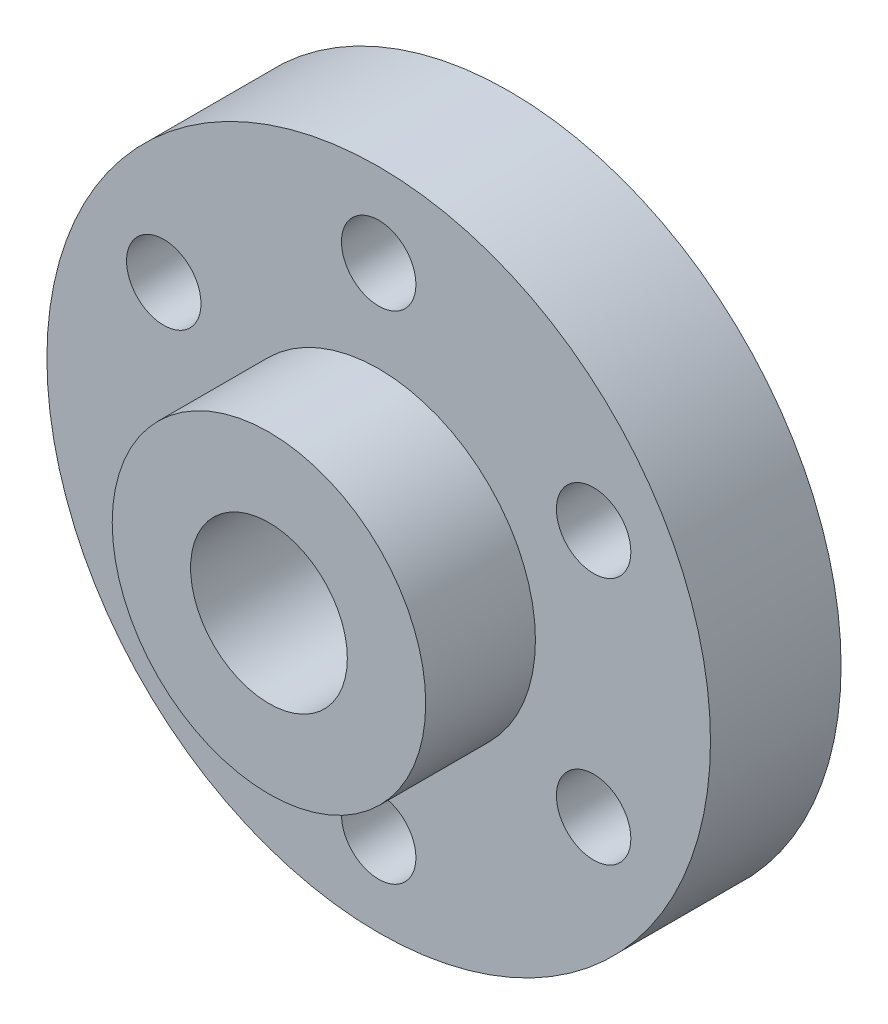
ISO-10303-21;
HEADER;
FILE_DESCRIPTION(('STEP AP214'),'2;1');
FILE_NAME('part.step','',(''),(''),'','','');
FILE_SCHEMA(('AUTOMOTIVE_DESIGN { 1 0 10303 214 1 1 1 1 }'));
ENDSEC;
DATA;
#1=APPLICATION_CONTEXT('core data for automotive mechanical design processes');
#2=APPLICATION_PROTOCOL_DEFINITION('international standard','automotive_design',2000,#1);
#3=PRODUCT_CONTEXT('',#1,'mechanical');
#4=PRODUCT('Part','Part','',(#3));
#5=PRODUCT_RELATED_PRODUCT_CATEGORY('part','',(#4));
#6=PRODUCT_DEFINITION_FORMATION('','',#4);
#7=PRODUCT_DEFINITION_CONTEXT('part definition',#1,'design');
#8=PRODUCT_DEFINITION('design','',#6,#7);
#9=PRODUCT_DEFINITION_SHAPE('','',#8);
#10=(LENGTH_UNIT() NAMED_UNIT(*) SI_UNIT(.MILLI.,.METRE.));
#11=(NAMED_UNIT(*) PLANE_ANGLE_UNIT() SI_UNIT($,.RADIAN.));
#12=(NAMED_UNIT(*) SI_UNIT($,.STERADIAN.) SOLID_ANGLE_UNIT());
#13=UNCERTAINTY_MEASURE_WITH_UNIT(LENGTH_MEASURE(1.E-05),#10,'distance_accuracy_value','');
#14=(GEOMETRIC_REPRESENTATION_CONTEXT(3) GLOBAL_UNCERTAINTY_ASSIGNED_CONTEXT((#13)) GLOBAL_UNIT_ASSIGNED_CONTEXT((#10,
#11,#12)) REPRESENTATION_CONTEXT('',''));
#15=CARTESIAN_POINT('',(0.,0.,0.));
#16=DIRECTION('',(0.,0.,1.));
#17=DIRECTION('',(1.,0.,0.));
#18=AXIS2_PLACEMENT_3D('',#15,#16,#17);
#19=CARTESIAN_POINT('',(0.,0.,5.));
#20=DIRECTION('',(0.,0.,-1.));
#21=DIRECTION('',(-1.,0.,0.));
#22=AXIS2_PLACEMENT_3D('',#19,#20,#21);
#23=CYLINDRICAL_SURFACE('',#22,12.7);
#24=CARTESIAN_POINT('',(0.,0.,5.));
#25=DIRECTION('',(0.,0.,1.));
#26=DIRECTION('',(1.,0.,0.));
#27=AXIS2_PLACEMENT_3D('',#24,#25,#26);
#28=CIRCLE('',#27,12.7);
#29=CARTESIAN_POINT('',(12.7,0.,5.));
#30=VERTEX_POINT('',#29);
#31=EDGE_CURVE('E42',#30,#30,#28,.T.);
#32=ORIENTED_EDGE('',*,*,#31,.F.);
#33=EDGE_LOOP('',(#32));
#34=FACE_BOUND('',#33,.T.);
#35=CARTESIAN_POINT('',(0.,0.,0.));
#36=DIRECTION('',(0.,0.,1.));
#37=DIRECTION('',(1.,0.,0.));
#38=AXIS2_PLACEMENT_3D('',#35,#36,#37);
#39=CIRCLE('',#38,12.7);
#40=CARTESIAN_POINT('',(12.7,0.,0.));
#41=VERTEX_POINT('',#40);
#42=EDGE_CURVE('E47',#41,#41,#39,.T.);
#43=ORIENTED_EDGE('',*,*,#42,.T.);
#44=EDGE_LOOP('',(#43));
#45=FACE_BOUND('',#44,.T.);
#46=ADVANCED_FACE('F35',(#34,#45),#23,.T.);
#47=CARTESIAN_POINT('',(0.,0.,5.));
#48=DIRECTION('',(0.,0.,1.));
#49=DIRECTION('',(1.,0.,0.));
#50=AXIS2_PLACEMENT_3D('',#47,#48,#49);
#51=PLANE('',#50);
#52=CARTESIAN_POINT('',(0.,9.5,5.));
#53=DIRECTION('',(0.,0.,1.));
#54=DIRECTION('',(1.,0.,0.));
#55=AXIS2_PLACEMENT_3D('',#52,#53,#54);
#56=CIRCLE('',#55,1.425);
#57=CARTESIAN_POINT('',(1.425,9.5,5.));
#58=VERTEX_POINT('',#57);
#59=EDGE_CURVE('E60',#58,#58,#56,.T.);
#60=ORIENTED_EDGE('',*,*,#59,.F.);
#61=EDGE_LOOP('',(#60));
#62=FACE_BOUND('',#61,.T.);
#63=CARTESIAN_POINT('',(8.22724133595207,4.75000000000013,5.));
#64=DIRECTION('',(0.,0.,1.));
#65=DIRECTION('',(1.,0.,0.));
#66=AXIS2_PLACEMENT_3D('',#63,#64,#65);
#67=CIRCLE('',#66,1.42500000000018);
#68=CARTESIAN_POINT('',(9.65224133595225,4.75000000000013,5.));
#69=VERTEX_POINT('',#68);
#70=EDGE_CURVE('E69',#69,#69,#67,.T.);
#71=ORIENTED_EDGE('',*,*,#70,.F.);
#72=EDGE_LOOP('',(#71));
#73=FACE_BOUND('',#72,.T.);
#74=CARTESIAN_POINT('',(8.22724133595214,-4.74999999999972,5.));
#75=DIRECTION('',(0.,0.,1.));
#76=DIRECTION('',(1.,0.,0.));
#77=AXIS2_PLACEMENT_3D('',#74,#75,#76);
#78=CIRCLE('',#77,1.42500000000031);
#79=CARTESIAN_POINT('',(9.65224133595244,-4.74999999999972,5.));
#80=VERTEX_POINT('',#79);
#81=EDGE_CURVE('E75',#80,#80,#78,.T.);
#82=ORIENTED_EDGE('',*,*,#81,.F.);
#83=EDGE_LOOP('',(#82));
#84=FACE_BOUND('',#83,.T.);
#85=CARTESIAN_POINT('',(1.2878355113985E-13,-9.49999999999971,5.));
#86=DIRECTION('',(0.,0.,1.));
#87=DIRECTION('',(1.,0.,0.));
#88=AXIS2_PLACEMENT_3D('',#85,#86,#87);
#89=CIRCLE('',#88,1.42500000000027);
#90=CARTESIAN_POINT('',(1.4250000000004,-9.49999999999971,5.));
#91=VERTEX_POINT('',#90);
#92=EDGE_CURVE('E88',#91,#91,#89,.T.);
#93=ORIENTED_EDGE('',*,*,#92,.F.);
#94=EDGE_LOOP('',(#93));
#95=FACE_BOUND('',#94,.T.);
#96=CARTESIAN_POINT('',(-8.22724133595194,-4.74999999999984,5.));
#97=DIRECTION('',(0.,0.,1.));
#98=DIRECTION('',(1.,0.,0.));
#99=AXIS2_PLACEMENT_3D('',#96,#97,#98);
#100=CIRCLE('',#99,1.42500000000014);
#101=CARTESIAN_POINT('',(-6.80224133595181,-4.74999999999984,5.));
#102=VERTEX_POINT('',#101);
#103=EDGE_CURVE('E82',#102,#102,#100,.T.);
#104=ORIENTED_EDGE('',*,*,#103,.F.);
#105=EDGE_LOOP('',(#104));
#106=FACE_BOUND('',#105,.T.);
#107=CARTESIAN_POINT('',(-8.22724133595201,4.75000000000001,5.));
#108=DIRECTION('',(0.,0.,1.));
#109=DIRECTION('',(1.,0.,0.));
#110=AXIS2_PLACEMENT_3D('',#107,#108,#109);
#111=CIRCLE('',#110,1.42500000000006);
#112=CARTESIAN_POINT('',(-6.80224133595195,4.75000000000001,5.));
#113=VERTEX_POINT('',#112);
#114=EDGE_CURVE('E76',#113,#113,#111,.T.);
#115=ORIENTED_EDGE('',*,*,#114,.F.);
#116=EDGE_LOOP('',(#115));
#117=FACE_BOUND('',#116,.T.);
#118=CARTESIAN_POINT('',(0.,0.,5.));
#119=DIRECTION('',(0.,0.,1.));
#120=DIRECTION('',(1.,0.,0.));
#121=AXIS2_PLACEMENT_3D('',#118,#119,#120);
#122=CIRCLE('',#121,6.);
#123=CARTESIAN_POINT('',(6.,0.,5.));
#124=VERTEX_POINT('',#123);
#125=EDGE_CURVE('E10',#124,#124,#122,.T.);
#126=ORIENTED_EDGE('',*,*,#125,.F.);
#127=EDGE_LOOP('',(#126));
#128=FACE_BOUND('',#127,.T.);
#129=ORIENTED_EDGE('',*,*,#31,.T.);
#130=EDGE_LOOP('',(#129));
#131=FACE_BOUND('',#130,.T.);
#132=ADVANCED_FACE('F104',(#62,#73,#84,#95,#106,#117,#128,#131),#51,.T.);
#133=CARTESIAN_POINT('',(0.,0.,0.));
#134=DIRECTION('',(0.,0.,1.));
#135=DIRECTION('',(1.,0.,0.));
#136=AXIS2_PLACEMENT_3D('',#133,#134,#135);
#137=PLANE('',#136);
#138=CARTESIAN_POINT('',(0.,0.,0.));
#139=DIRECTION('',(0.,0.,1.));
#140=DIRECTION('',(1.,0.,0.));
#141=AXIS2_PLACEMENT_3D('',#138,#139,#140);
#142=CIRCLE('',#141,3.);
#143=CARTESIAN_POINT('',(3.,0.,0.));
#144=VERTEX_POINT('',#143);
#145=EDGE_CURVE('E242',#144,#144,#142,.T.);
#146=ORIENTED_EDGE('',*,*,#145,.T.);
#147=EDGE_LOOP('',(#146));
#148=FACE_BOUND('',#147,.T.);
#149=CARTESIAN_POINT('',(0.,9.5,0.));
#150=DIRECTION('',(0.,0.,1.));
#151=DIRECTION('',(1.,0.,0.));
#152=AXIS2_PLACEMENT_3D('',#149,#150,#151);
#153=CIRCLE('',#152,1.425);
#154=CARTESIAN_POINT('',(1.425,9.5,0.));
#155=VERTEX_POINT('',#154);
#156=EDGE_CURVE('E56',#155,#155,#153,.F.);
#157=ORIENTED_EDGE('',*,*,#156,.F.);
#158=EDGE_LOOP('',(#157));
#159=FACE_BOUND('',#158,.T.);
#160=CARTESIAN_POINT('',(8.22724133595207,4.75000000000013,0.));
#161=DIRECTION('',(0.,0.,1.));
#162=DIRECTION('',(1.,0.,0.));
#163=AXIS2_PLACEMENT_3D('',#160,#161,#162);
#164=CIRCLE('',#163,1.42500000000018);
#165=CARTESIAN_POINT('',(9.65224133595225,4.75000000000013,0.));
#166=VERTEX_POINT('',#165);
#167=EDGE_CURVE('E72',#166,#166,#164,.F.);
#168=ORIENTED_EDGE('',*,*,#167,.F.);
#169=EDGE_LOOP('',(#168));
#170=FACE_BOUND('',#169,.T.);
#171=CARTESIAN_POINT('',(8.22724133595214,-4.74999999999972,0.));
#172=DIRECTION('',(0.,0.,1.));
#173=DIRECTION('',(1.,0.,0.));
#174=AXIS2_PLACEMENT_3D('',#171,#172,#173);
#175=CIRCLE('',#174,1.42500000000031);
#176=CARTESIAN_POINT('',(9.65224133595244,-4.74999999999972,0.));
#177=VERTEX_POINT('',#176);
#178=EDGE_CURVE('E91',#177,#177,#175,.F.);
#179=ORIENTED_EDGE('',*,*,#178,.F.);
#180=EDGE_LOOP('',(#179));
#181=FACE_BOUND('',#180,.T.);
#182=CARTESIAN_POINT('',(1.2878355113985E-13,-9.49999999999971,0.));
#183=DIRECTION('',(0.,0.,1.));
#184=DIRECTION('',(1.,0.,0.));
#185=AXIS2_PLACEMENT_3D('',#182,#183,#184);
#186=CIRCLE('',#185,1.42500000000027);
#187=CARTESIAN_POINT('',(1.4250000000004,-9.49999999999971,0.));
#188=VERTEX_POINT('',#187);
#189=EDGE_CURVE('E85',#188,#188,#186,.F.);
#190=ORIENTED_EDGE('',*,*,#189,.F.);
#191=EDGE_LOOP('',(#190));
#192=FACE_BOUND('',#191,.T.);
#193=CARTESIAN_POINT('',(-8.22724133595194,-4.74999999999984,0.));
#194=DIRECTION('',(0.,0.,1.));
#195=DIRECTION('',(1.,0.,0.));
#196=AXIS2_PLACEMENT_3D('',#193,#194,#195);
#197=CIRCLE('',#196,1.42500000000014);
#198=CARTESIAN_POINT('',(-6.80224133595181,-4.74999999999984,0.));
#199=VERTEX_POINT('',#198);
#200=EDGE_CURVE('E79',#199,#199,#197,.F.);
#201=ORIENTED_EDGE('',*,*,#200,.F.);
#202=EDGE_LOOP('',(#201));
#203=FACE_BOUND('',#202,.T.);
#204=CARTESIAN_POINT('',(-8.22724133595201,4.75000000000001,0.));
#205=DIRECTION('',(0.,0.,1.));
#206=DIRECTION('',(1.,0.,0.));
#207=AXIS2_PLACEMENT_3D('',#204,#205,#206);
#208=CIRCLE('',#207,1.42500000000006);
#209=CARTESIAN_POINT('',(-6.80224133595195,4.75000000000001,0.));
#210=VERTEX_POINT('',#209);
#211=EDGE_CURVE('E65',#210,#210,#208,.F.);
#212=ORIENTED_EDGE('',*,*,#211,.F.);
#213=EDGE_LOOP('',(#212));
#214=FACE_BOUND('',#213,.T.);
#215=ORIENTED_EDGE('',*,*,#42,.F.);
#216=EDGE_LOOP('',(#215));
#217=FACE_BOUND('',#216,.T.);
#218=ADVANCED_FACE('F100',(#148,#159,#170,#181,#192,#203,#214,#217),#137,.F.);
#219=CARTESIAN_POINT('',(0.,0.,9.2));
#220=DIRECTION('',(0.,0.,-1.));
#221=DIRECTION('',(-1.,0.,0.));
#222=AXIS2_PLACEMENT_3D('',#219,#220,#221);
#223=CYLINDRICAL_SURFACE('',#222,6.);
#224=CARTESIAN_POINT('',(0.,0.,9.2));
#225=DIRECTION('',(0.,0.,1.));
#226=DIRECTION('',(1.,0.,0.));
#227=AXIS2_PLACEMENT_3D('',#224,#225,#226);
#228=CIRCLE('',#227,6.);
#229=CARTESIAN_POINT('',(6.,0.,9.2));
#230=VERTEX_POINT('',#229);
#231=EDGE_CURVE('E50',#230,#230,#228,.T.);
#232=ORIENTED_EDGE('',*,*,#231,.F.);
#233=EDGE_LOOP('',(#232));
#234=FACE_BOUND('',#233,.T.);
#235=ORIENTED_EDGE('',*,*,#125,.T.);
#236=EDGE_LOOP('',(#235));
#237=FACE_BOUND('',#236,.T.);
#238=ADVANCED_FACE('F103',(#234,#237),#223,.T.);
#239=CARTESIAN_POINT('',(0.,0.,9.2));
#240=DIRECTION('',(0.,0.,1.));
#241=DIRECTION('',(1.,0.,0.));
#242=AXIS2_PLACEMENT_3D('',#239,#240,#241);
#243=PLANE('',#242);
#244=CARTESIAN_POINT('',(0.,0.,9.2));
#245=DIRECTION('',(0.,0.,1.));
#246=DIRECTION('',(1.,0.,0.));
#247=AXIS2_PLACEMENT_3D('',#244,#245,#246);
#248=CIRCLE('',#247,3.);
#249=CARTESIAN_POINT('',(3.,0.,9.2));
#250=VERTEX_POINT('',#249);
#251=EDGE_CURVE('E38',#250,#250,#248,.T.);
#252=ORIENTED_EDGE('',*,*,#251,.F.);
#253=EDGE_LOOP('',(#252));
#254=FACE_BOUND('',#253,.T.);
#255=ORIENTED_EDGE('',*,*,#231,.T.);
#256=EDGE_LOOP('',(#255));
#257=FACE_BOUND('',#256,.T.);
#258=ADVANCED_FACE('F116',(#254,#257),#243,.T.);
#259=CARTESIAN_POINT('',(-8.22724133595201,4.75000000000001,-0.00100000000000013));
#260=DIRECTION('',(0.,0.,1.));
#261=DIRECTION('',(1.,0.,0.));
#262=AXIS2_PLACEMENT_3D('',#259,#260,#261);
#263=CYLINDRICAL_SURFACE('',#262,1.42500000000006);
#264=ORIENTED_EDGE('',*,*,#114,.T.);
#265=EDGE_LOOP('',(#264));
#266=FACE_BOUND('',#265,.T.);
#267=ORIENTED_EDGE('',*,*,#211,.T.);
#268=EDGE_LOOP('',(#267));
#269=FACE_BOUND('',#268,.T.);
#270=ADVANCED_FACE('F113',(#266,#269),#263,.F.);
#271=CARTESIAN_POINT('',(-8.22724133595194,-4.74999999999984,-0.00100000000000013));
#272=DIRECTION('',(0.,0.,1.));
#273=DIRECTION('',(1.,0.,0.));
#274=AXIS2_PLACEMENT_3D('',#271,#272,#273);
#275=CYLINDRICAL_SURFACE('',#274,1.42500000000014);
#276=ORIENTED_EDGE('',*,*,#103,.T.);
#277=EDGE_LOOP('',(#276));
#278=FACE_BOUND('',#277,.T.);
#279=ORIENTED_EDGE('',*,*,#200,.T.);
#280=EDGE_LOOP('',(#279));
#281=FACE_BOUND('',#280,.T.);
#282=ADVANCED_FACE('F115',(#278,#281),#275,.F.);
#283=CARTESIAN_POINT('',(1.2878355113985E-13,-9.49999999999971,-0.00100000000000013));
#284=DIRECTION('',(0.,0.,1.));
#285=DIRECTION('',(1.,0.,0.));
#286=AXIS2_PLACEMENT_3D('',#283,#284,#285);
#287=CYLINDRICAL_SURFACE('',#286,1.42500000000027);
#288=ORIENTED_EDGE('',*,*,#92,.T.);
#289=EDGE_LOOP('',(#288));
#290=FACE_BOUND('',#289,.T.);
#291=ORIENTED_EDGE('',*,*,#189,.T.);
#292=EDGE_LOOP('',(#291));
#293=FACE_BOUND('',#292,.T.);
#294=ADVANCED_FACE('F123',(#290,#293),#287,.F.);
#295=CARTESIAN_POINT('',(8.22724133595214,-4.74999999999972,-0.00100000000000013));
#296=DIRECTION('',(0.,0.,1.));
#297=DIRECTION('',(1.,0.,0.));
#298=AXIS2_PLACEMENT_3D('',#295,#296,#297);
#299=CYLINDRICAL_SURFACE('',#298,1.42500000000031);
#300=ORIENTED_EDGE('',*,*,#81,.T.);
#301=EDGE_LOOP('',(#300));
#302=FACE_BOUND('',#301,.T.);
#303=ORIENTED_EDGE('',*,*,#178,.T.);
#304=EDGE_LOOP('',(#303));
#305=FACE_BOUND('',#304,.T.);
#306=ADVANCED_FACE('F98',(#302,#305),#299,.F.);
#307=CARTESIAN_POINT('',(8.22724133595207,4.75000000000013,-0.00100000000000013));
#308=DIRECTION('',(0.,0.,1.));
#309=DIRECTION('',(1.,0.,0.));
#310=AXIS2_PLACEMENT_3D('',#307,#308,#309);
#311=CYLINDRICAL_SURFACE('',#310,1.42500000000018);
#312=ORIENTED_EDGE('',*,*,#70,.T.);
#313=EDGE_LOOP('',(#312));
#314=FACE_BOUND('',#313,.T.);
#315=ORIENTED_EDGE('',*,*,#167,.T.);
#316=EDGE_LOOP('',(#315));
#317=FACE_BOUND('',#316,.T.);
#318=ADVANCED_FACE('F148',(#314,#317),#311,.F.);
#319=CARTESIAN_POINT('',(0.,9.5,-0.00100000000000013));
#320=DIRECTION('',(0.,0.,1.));
#321=DIRECTION('',(1.,0.,0.));
#322=AXIS2_PLACEMENT_3D('',#319,#320,#321);
#323=CYLINDRICAL_SURFACE('',#322,1.425);
#324=ORIENTED_EDGE('',*,*,#59,.T.);
#325=EDGE_LOOP('',(#324));
#326=FACE_BOUND('',#325,.T.);
#327=ORIENTED_EDGE('',*,*,#156,.T.);
#328=EDGE_LOOP('',(#327));
#329=FACE_BOUND('',#328,.T.);
#330=ADVANCED_FACE('F175',(#326,#329),#323,.F.);
#331=CARTESIAN_POINT('',(0.,0.,0.));
#332=DIRECTION('',(0.,0.,1.));
#333=DIRECTION('',(1.,0.,0.));
#334=AXIS2_PLACEMENT_3D('',#331,#332,#333);
#335=CYLINDRICAL_SURFACE('',#334,3.);
#336=ORIENTED_EDGE('',*,*,#251,.T.);
#337=EDGE_LOOP('',(#336));
#338=FACE_BOUND('',#337,.T.);
#339=ORIENTED_EDGE('',*,*,#145,.F.);
#340=EDGE_LOOP('',(#339));
#341=FACE_BOUND('',#340,.T.);
#342=ADVANCED_FACE('F182',(#338,#341),#335,.F.);
#343=CLOSED_SHELL('',(#46,#132,#218,#238,#258,#270,#282,#294,#306,#318,#330,#342));
#344=MANIFOLD_SOLID_BREP('B2',#343);
#345=ADVANCED_BREP_SHAPE_REPRESENTATION('',(#18,#344),#14);
#346=SHAPE_DEFINITION_REPRESENTATION(#9,#345);
ENDSEC;
END-ISO-10303-21;
